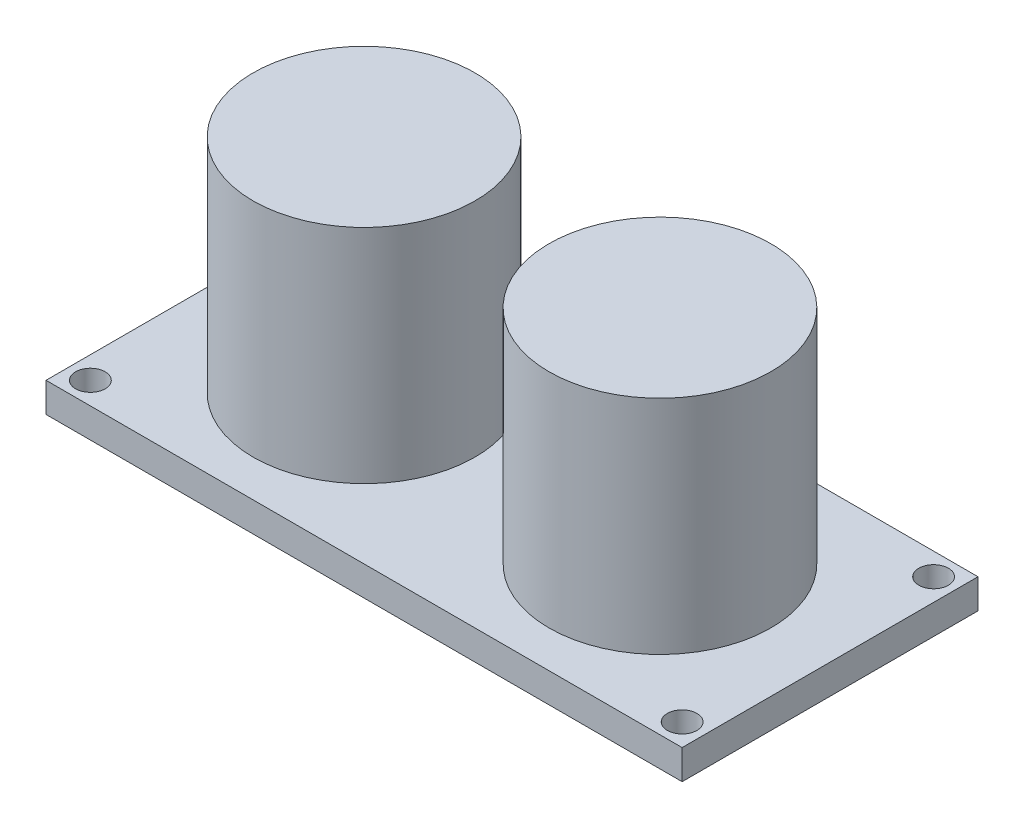
ISO-10303-21;
HEADER;
FILE_DESCRIPTION(('STEP AP214'),'2;1');
FILE_NAME('part.step','',(''),(''),'','','');
FILE_SCHEMA(('AUTOMOTIVE_DESIGN { 1 0 10303 214 1 1 1 1 }'));
ENDSEC;
DATA;
#1=APPLICATION_CONTEXT('core data for automotive mechanical design processes');
#2=APPLICATION_PROTOCOL_DEFINITION('international standard','automotive_design',2000,#1);
#3=PRODUCT_CONTEXT('',#1,'mechanical');
#4=PRODUCT('Part','Part','',(#3));
#5=PRODUCT_RELATED_PRODUCT_CATEGORY('part','',(#4));
#6=PRODUCT_DEFINITION_FORMATION('','',#4);
#7=PRODUCT_DEFINITION_CONTEXT('part definition',#1,'design');
#8=PRODUCT_DEFINITION('design','',#6,#7);
#9=PRODUCT_DEFINITION_SHAPE('','',#8);
#10=(LENGTH_UNIT() NAMED_UNIT(*) SI_UNIT(.MILLI.,.METRE.));
#11=(NAMED_UNIT(*) PLANE_ANGLE_UNIT() SI_UNIT($,.RADIAN.));
#12=(NAMED_UNIT(*) SI_UNIT($,.STERADIAN.) SOLID_ANGLE_UNIT());
#13=UNCERTAINTY_MEASURE_WITH_UNIT(LENGTH_MEASURE(1.E-05),#10,'distance_accuracy_value','');
#14=(GEOMETRIC_REPRESENTATION_CONTEXT(3) GLOBAL_UNCERTAINTY_ASSIGNED_CONTEXT((#13)) GLOBAL_UNIT_ASSIGNED_CONTEXT((#10,
#11,#12)) REPRESENTATION_CONTEXT('',''));
#15=CARTESIAN_POINT('',(0.,0.,0.));
#16=DIRECTION('',(0.,0.,1.));
#17=DIRECTION('',(1.,0.,0.));
#18=AXIS2_PLACEMENT_3D('',#15,#16,#17);
#19=CARTESIAN_POINT('',(-19.6156682014462,2.,-8.40872781352872));
#20=DIRECTION('',(1.,0.,0.));
#21=DIRECTION('',(0.,0.,-1.));
#22=AXIS2_PLACEMENT_3D('',#19,#20,#21);
#23=PLANE('',#22);
#24=DIRECTION('',(0.,0.,1.));
#25=VECTOR('',#24,1.);
#26=CARTESIAN_POINT('',(-19.6156682014462,0.,-8.40872781352872));
#27=LINE('',#26,#25);
#28=CARTESIAN_POINT('',(-19.6156682014462,0.,-8.40872781352872));
#29=VERTEX_POINT('',#28);
#30=CARTESIAN_POINT('',(-19.6156682014462,0.,11.5912721864713));
#31=VERTEX_POINT('',#30);
#32=EDGE_CURVE('E98',#29,#31,#27,.T.);
#33=ORIENTED_EDGE('',*,*,#32,.T.);
#34=DIRECTION('',(0.,-1.,0.));
#35=VECTOR('',#34,1.);
#36=CARTESIAN_POINT('',(-19.6156682014462,2.,11.5912721864713));
#37=LINE('',#36,#35);
#38=CARTESIAN_POINT('',(-19.6156682014462,2.,11.5912721864713));
#39=VERTEX_POINT('',#38);
#40=EDGE_CURVE('E11',#39,#31,#37,.T.);
#41=ORIENTED_EDGE('',*,*,#40,.F.);
#42=DIRECTION('',(0.,0.,1.));
#43=VECTOR('',#42,1.);
#44=CARTESIAN_POINT('',(-19.6156682014462,2.,-8.40872781352872));
#45=LINE('',#44,#43);
#46=CARTESIAN_POINT('',(-19.6156682014462,2.,-8.40872781352872));
#47=VERTEX_POINT('',#46);
#48=EDGE_CURVE('E86',#47,#39,#45,.T.);
#49=ORIENTED_EDGE('',*,*,#48,.F.);
#50=DIRECTION('',(0.,-1.,0.));
#51=VECTOR('',#50,1.);
#52=CARTESIAN_POINT('',(-19.6156682014462,2.,-8.40872781352872));
#53=LINE('',#52,#51);
#54=EDGE_CURVE('E94',#47,#29,#53,.T.);
#55=ORIENTED_EDGE('',*,*,#54,.T.);
#56=EDGE_LOOP('',(#33,#41,#49,#55));
#57=FACE_BOUND('',#56,.T.);
#58=ADVANCED_FACE('F35',(#57),#23,.F.);
#59=CARTESIAN_POINT('',(-19.6156682014462,2.,11.5912721864713));
#60=DIRECTION('',(0.,0.,-1.));
#61=DIRECTION('',(-1.,0.,0.));
#62=AXIS2_PLACEMENT_3D('',#59,#60,#61);
#63=PLANE('',#62);
#64=DIRECTION('',(1.,0.,0.));
#65=VECTOR('',#64,1.);
#66=CARTESIAN_POINT('',(-19.6156682014462,0.,11.5912721864713));
#67=LINE('',#66,#65);
#68=CARTESIAN_POINT('',(23.3843317985538,0.,11.5912721864713));
#69=VERTEX_POINT('',#68);
#70=EDGE_CURVE('E90',#31,#69,#67,.T.);
#71=ORIENTED_EDGE('',*,*,#70,.T.);
#72=DIRECTION('',(0.,-1.,0.));
#73=VECTOR('',#72,1.);
#74=CARTESIAN_POINT('',(23.3843317985538,2.,11.5912721864713));
#75=LINE('',#74,#73);
#76=CARTESIAN_POINT('',(23.3843317985538,2.,11.5912721864713));
#77=VERTEX_POINT('',#76);
#78=EDGE_CURVE('E43',#77,#69,#75,.T.);
#79=ORIENTED_EDGE('',*,*,#78,.F.);
#80=DIRECTION('',(1.,0.,0.));
#81=VECTOR('',#80,1.);
#82=CARTESIAN_POINT('',(-19.6156682014462,2.,11.5912721864713));
#83=LINE('',#82,#81);
#84=EDGE_CURVE('E81',#39,#77,#83,.T.);
#85=ORIENTED_EDGE('',*,*,#84,.F.);
#86=ORIENTED_EDGE('',*,*,#40,.T.);
#87=EDGE_LOOP('',(#71,#79,#85,#86));
#88=FACE_BOUND('',#87,.T.);
#89=ADVANCED_FACE('F89',(#88),#63,.F.);
#90=CARTESIAN_POINT('',(23.3843317985538,2.,-8.40872781352872));
#91=DIRECTION('',(-1.,0.,0.));
#92=DIRECTION('',(0.,0.,1.));
#93=AXIS2_PLACEMENT_3D('',#90,#91,#92);
#94=PLANE('',#93);
#95=DIRECTION('',(0.,0.,-1.));
#96=VECTOR('',#95,1.);
#97=CARTESIAN_POINT('',(23.3843317985538,0.,-8.40872781352872));
#98=LINE('',#97,#96);
#99=CARTESIAN_POINT('',(23.3843317985538,0.,-8.40872781352872));
#100=VERTEX_POINT('',#99);
#101=EDGE_CURVE('E68',#69,#100,#98,.T.);
#102=ORIENTED_EDGE('',*,*,#101,.T.);
#103=DIRECTION('',(0.,-1.,0.));
#104=VECTOR('',#103,1.);
#105=CARTESIAN_POINT('',(23.3843317985538,2.,-8.40872781352872));
#106=LINE('',#105,#104);
#107=CARTESIAN_POINT('',(23.3843317985538,2.,-8.40872781352872));
#108=VERTEX_POINT('',#107);
#109=EDGE_CURVE('E91',#108,#100,#106,.T.);
#110=ORIENTED_EDGE('',*,*,#109,.F.);
#111=DIRECTION('',(0.,0.,-1.));
#112=VECTOR('',#111,1.);
#113=CARTESIAN_POINT('',(23.3843317985538,2.,-8.40872781352872));
#114=LINE('',#113,#112);
#115=EDGE_CURVE('E84',#77,#108,#114,.T.);
#116=ORIENTED_EDGE('',*,*,#115,.F.);
#117=ORIENTED_EDGE('',*,*,#78,.T.);
#118=EDGE_LOOP('',(#102,#110,#116,#117));
#119=FACE_BOUND('',#118,.T.);
#120=ADVANCED_FACE('F92',(#119),#94,.F.);
#121=CARTESIAN_POINT('',(-19.6156682014462,2.,-8.40872781352872));
#122=DIRECTION('',(0.,0.,1.));
#123=DIRECTION('',(1.,0.,0.));
#124=AXIS2_PLACEMENT_3D('',#121,#122,#123);
#125=PLANE('',#124);
#126=DIRECTION('',(-1.,0.,0.));
#127=VECTOR('',#126,1.);
#128=CARTESIAN_POINT('',(-19.6156682014462,0.,-8.40872781352872));
#129=LINE('',#128,#127);
#130=EDGE_CURVE('E74',#100,#29,#129,.T.);
#131=ORIENTED_EDGE('',*,*,#130,.T.);
#132=ORIENTED_EDGE('',*,*,#54,.F.);
#133=DIRECTION('',(-1.,0.,0.));
#134=VECTOR('',#133,1.);
#135=CARTESIAN_POINT('',(-19.6156682014462,2.,-8.40872781352872));
#136=LINE('',#135,#134);
#137=EDGE_CURVE('E51',#108,#47,#136,.T.);
#138=ORIENTED_EDGE('',*,*,#137,.F.);
#139=ORIENTED_EDGE('',*,*,#109,.T.);
#140=EDGE_LOOP('',(#131,#132,#138,#139));
#141=FACE_BOUND('',#140,.T.);
#142=ADVANCED_FACE('F106',(#141),#125,.F.);
#143=CARTESIAN_POINT('',(0.,2.,0.));
#144=DIRECTION('',(0.,1.,0.));
#145=DIRECTION('',(0.,0.,1.));
#146=AXIS2_PLACEMENT_3D('',#143,#144,#145);
#147=PLANE('',#146);
#148=CARTESIAN_POINT('',(-8.11566820144619,2.,1.59127218647128));
#149=DIRECTION('',(0.,1.,0.));
#150=DIRECTION('',(0.,0.,1.));
#151=AXIS2_PLACEMENT_3D('',#148,#149,#150);
#152=CIRCLE('',#151,7.5);
#153=CARTESIAN_POINT('',(-8.11566820144619,2.,9.09127218647128));
#154=VERTEX_POINT('',#153);
#155=EDGE_CURVE('E142',#154,#154,#152,.T.);
#156=ORIENTED_EDGE('',*,*,#155,.F.);
#157=EDGE_LOOP('',(#156));
#158=FACE_BOUND('',#157,.T.);
#159=CARTESIAN_POINT('',(11.8843317985538,2.,1.59127218647128));
#160=DIRECTION('',(0.,1.,0.));
#161=DIRECTION('',(0.,0.,1.));
#162=AXIS2_PLACEMENT_3D('',#159,#160,#161);
#163=CIRCLE('',#162,7.5);
#164=CARTESIAN_POINT('',(11.8843317985538,2.,9.09127218647128));
#165=VERTEX_POINT('',#164);
#166=EDGE_CURVE('E136',#165,#165,#163,.T.);
#167=ORIENTED_EDGE('',*,*,#166,.F.);
#168=EDGE_LOOP('',(#167));
#169=FACE_BOUND('',#168,.T.);
#170=CARTESIAN_POINT('',(21.8843317985538,2.,-6.90872781352872));
#171=DIRECTION('',(0.,1.,0.));
#172=DIRECTION('',(0.,0.,1.));
#173=AXIS2_PLACEMENT_3D('',#170,#171,#172);
#174=CIRCLE('',#173,1.);
#175=CARTESIAN_POINT('',(21.8843317985538,2.,-5.90872781352872));
#176=VERTEX_POINT('',#175);
#177=EDGE_CURVE('E130',#176,#176,#174,.T.);
#178=ORIENTED_EDGE('',*,*,#177,.F.);
#179=EDGE_LOOP('',(#178));
#180=FACE_BOUND('',#179,.T.);
#181=CARTESIAN_POINT('',(-18.1156682014462,2.,-6.90872781352872));
#182=DIRECTION('',(0.,1.,0.));
#183=DIRECTION('',(0.,0.,1.));
#184=AXIS2_PLACEMENT_3D('',#181,#182,#183);
#185=CIRCLE('',#184,1.);
#186=CARTESIAN_POINT('',(-18.1156682014462,2.,-5.90872781352872));
#187=VERTEX_POINT('',#186);
#188=EDGE_CURVE('E124',#187,#187,#185,.T.);
#189=ORIENTED_EDGE('',*,*,#188,.F.);
#190=EDGE_LOOP('',(#189));
#191=FACE_BOUND('',#190,.T.);
#192=CARTESIAN_POINT('',(21.8843317985538,2.,10.0912721864713));
#193=DIRECTION('',(0.,1.,0.));
#194=DIRECTION('',(0.,0.,1.));
#195=AXIS2_PLACEMENT_3D('',#192,#193,#194);
#196=CIRCLE('',#195,1.);
#197=CARTESIAN_POINT('',(21.8843317985538,2.,11.0912721864713));
#198=VERTEX_POINT('',#197);
#199=EDGE_CURVE('E118',#198,#198,#196,.T.);
#200=ORIENTED_EDGE('',*,*,#199,.F.);
#201=EDGE_LOOP('',(#200));
#202=FACE_BOUND('',#201,.T.);
#203=CARTESIAN_POINT('',(-18.1156682014462,2.,10.0912721864713));
#204=DIRECTION('',(0.,1.,0.));
#205=DIRECTION('',(0.,0.,1.));
#206=AXIS2_PLACEMENT_3D('',#203,#204,#205);
#207=CIRCLE('',#206,1.);
#208=CARTESIAN_POINT('',(-18.1156682014462,2.,11.0912721864713));
#209=VERTEX_POINT('',#208);
#210=EDGE_CURVE('E112',#209,#209,#207,.T.);
#211=ORIENTED_EDGE('',*,*,#210,.F.);
#212=EDGE_LOOP('',(#211));
#213=FACE_BOUND('',#212,.T.);
#214=ORIENTED_EDGE('',*,*,#48,.T.);
#215=ORIENTED_EDGE('',*,*,#84,.T.);
#216=ORIENTED_EDGE('',*,*,#115,.T.);
#217=ORIENTED_EDGE('',*,*,#137,.T.);
#218=EDGE_LOOP('',(#214,#215,#216,#217));
#219=FACE_BOUND('',#218,.T.);
#220=ADVANCED_FACE('F82',(#158,#169,#180,#191,#202,#213,#219),#147,.T.);
#221=CARTESIAN_POINT('',(0.,0.,0.));
#222=DIRECTION('',(0.,1.,0.));
#223=DIRECTION('',(0.,0.,1.));
#224=AXIS2_PLACEMENT_3D('',#221,#222,#223);
#225=PLANE('',#224);
#226=CARTESIAN_POINT('',(21.8843317985538,0.,-6.90872781352872));
#227=DIRECTION('',(0.,1.,0.));
#228=DIRECTION('',(0.,0.,1.));
#229=AXIS2_PLACEMENT_3D('',#226,#227,#228);
#230=CIRCLE('',#229,1.);
#231=CARTESIAN_POINT('',(21.8843317985538,0.,-5.90872781352872));
#232=VERTEX_POINT('',#231);
#233=EDGE_CURVE('E127',#232,#232,#230,.T.);
#234=ORIENTED_EDGE('',*,*,#233,.T.);
#235=EDGE_LOOP('',(#234));
#236=FACE_BOUND('',#235,.T.);
#237=CARTESIAN_POINT('',(-18.1156682014462,0.,-6.90872781352872));
#238=DIRECTION('',(0.,1.,0.));
#239=DIRECTION('',(0.,0.,1.));
#240=AXIS2_PLACEMENT_3D('',#237,#238,#239);
#241=CIRCLE('',#240,1.);
#242=CARTESIAN_POINT('',(-18.1156682014462,0.,-5.90872781352872));
#243=VERTEX_POINT('',#242);
#244=EDGE_CURVE('E121',#243,#243,#241,.T.);
#245=ORIENTED_EDGE('',*,*,#244,.T.);
#246=EDGE_LOOP('',(#245));
#247=FACE_BOUND('',#246,.T.);
#248=CARTESIAN_POINT('',(21.8843317985538,0.,10.0912721864713));
#249=DIRECTION('',(0.,1.,0.));
#250=DIRECTION('',(0.,0.,1.));
#251=AXIS2_PLACEMENT_3D('',#248,#249,#250);
#252=CIRCLE('',#251,1.);
#253=CARTESIAN_POINT('',(21.8843317985538,0.,11.0912721864713));
#254=VERTEX_POINT('',#253);
#255=EDGE_CURVE('E115',#254,#254,#252,.T.);
#256=ORIENTED_EDGE('',*,*,#255,.T.);
#257=EDGE_LOOP('',(#256));
#258=FACE_BOUND('',#257,.T.);
#259=CARTESIAN_POINT('',(-18.1156682014462,0.,10.0912721864713));
#260=DIRECTION('',(0.,1.,0.));
#261=DIRECTION('',(0.,0.,1.));
#262=AXIS2_PLACEMENT_3D('',#259,#260,#261);
#263=CIRCLE('',#262,1.);
#264=CARTESIAN_POINT('',(-18.1156682014462,0.,11.0912721864713));
#265=VERTEX_POINT('',#264);
#266=EDGE_CURVE('E101',#265,#265,#263,.T.);
#267=ORIENTED_EDGE('',*,*,#266,.T.);
#268=EDGE_LOOP('',(#267));
#269=FACE_BOUND('',#268,.T.);
#270=ORIENTED_EDGE('',*,*,#32,.F.);
#271=ORIENTED_EDGE('',*,*,#130,.F.);
#272=ORIENTED_EDGE('',*,*,#101,.F.);
#273=ORIENTED_EDGE('',*,*,#70,.F.);
#274=EDGE_LOOP('',(#270,#271,#272,#273));
#275=FACE_BOUND('',#274,.T.);
#276=ADVANCED_FACE('F109',(#236,#247,#258,#269,#275),#225,.F.);
#277=CARTESIAN_POINT('',(-18.1156682014462,0.,10.0912721864713));
#278=DIRECTION('',(0.,1.,0.));
#279=DIRECTION('',(0.,0.,1.));
#280=AXIS2_PLACEMENT_3D('',#277,#278,#279);
#281=CYLINDRICAL_SURFACE('',#280,1.);
#282=ORIENTED_EDGE('',*,*,#266,.F.);
#283=EDGE_LOOP('',(#282));
#284=FACE_BOUND('',#283,.T.);
#285=ORIENTED_EDGE('',*,*,#210,.T.);
#286=EDGE_LOOP('',(#285));
#287=FACE_BOUND('',#286,.T.);
#288=ADVANCED_FACE('F170',(#284,#287),#281,.F.);
#289=CARTESIAN_POINT('',(21.8843317985538,0.,10.0912721864713));
#290=DIRECTION('',(0.,1.,0.));
#291=DIRECTION('',(0.,0.,1.));
#292=AXIS2_PLACEMENT_3D('',#289,#290,#291);
#293=CYLINDRICAL_SURFACE('',#292,1.);
#294=ORIENTED_EDGE('',*,*,#255,.F.);
#295=EDGE_LOOP('',(#294));
#296=FACE_BOUND('',#295,.T.);
#297=ORIENTED_EDGE('',*,*,#199,.T.);
#298=EDGE_LOOP('',(#297));
#299=FACE_BOUND('',#298,.T.);
#300=ADVANCED_FACE('F172',(#296,#299),#293,.F.);
#301=CARTESIAN_POINT('',(-18.1156682014462,0.,-6.90872781352872));
#302=DIRECTION('',(0.,1.,0.));
#303=DIRECTION('',(0.,0.,1.));
#304=AXIS2_PLACEMENT_3D('',#301,#302,#303);
#305=CYLINDRICAL_SURFACE('',#304,1.);
#306=ORIENTED_EDGE('',*,*,#244,.F.);
#307=EDGE_LOOP('',(#306));
#308=FACE_BOUND('',#307,.T.);
#309=ORIENTED_EDGE('',*,*,#188,.T.);
#310=EDGE_LOOP('',(#309));
#311=FACE_BOUND('',#310,.T.);
#312=ADVANCED_FACE('F179',(#308,#311),#305,.F.);
#313=CARTESIAN_POINT('',(21.8843317985538,0.,-6.90872781352872));
#314=DIRECTION('',(0.,1.,0.));
#315=DIRECTION('',(0.,0.,1.));
#316=AXIS2_PLACEMENT_3D('',#313,#314,#315);
#317=CYLINDRICAL_SURFACE('',#316,1.);
#318=ORIENTED_EDGE('',*,*,#233,.F.);
#319=EDGE_LOOP('',(#318));
#320=FACE_BOUND('',#319,.T.);
#321=ORIENTED_EDGE('',*,*,#177,.T.);
#322=EDGE_LOOP('',(#321));
#323=FACE_BOUND('',#322,.T.);
#324=ADVANCED_FACE('F227',(#320,#323),#317,.F.);
#325=CARTESIAN_POINT('',(11.8843317985538,17.,1.59127218647128));
#326=DIRECTION('',(0.,-1.,0.));
#327=DIRECTION('',(0.,0.,-1.));
#328=AXIS2_PLACEMENT_3D('',#325,#326,#327);
#329=CYLINDRICAL_SURFACE('',#328,7.5);
#330=CARTESIAN_POINT('',(11.8843317985538,17.,1.59127218647128));
#331=DIRECTION('',(0.,1.,0.));
#332=DIRECTION('',(0.,0.,1.));
#333=AXIS2_PLACEMENT_3D('',#330,#331,#332);
#334=CIRCLE('',#333,7.5);
#335=CARTESIAN_POINT('',(11.8843317985538,17.,9.09127218647128));
#336=VERTEX_POINT('',#335);
#337=EDGE_CURVE('E133',#336,#336,#334,.T.);
#338=ORIENTED_EDGE('',*,*,#337,.F.);
#339=EDGE_LOOP('',(#338));
#340=FACE_BOUND('',#339,.T.);
#341=ORIENTED_EDGE('',*,*,#166,.T.);
#342=EDGE_LOOP('',(#341));
#343=FACE_BOUND('',#342,.T.);
#344=ADVANCED_FACE('F236',(#340,#343),#329,.T.);
#345=CARTESIAN_POINT('',(11.8843317985538,17.,1.59127218647128));
#346=DIRECTION('',(0.,1.,0.));
#347=DIRECTION('',(0.,0.,1.));
#348=AXIS2_PLACEMENT_3D('',#345,#346,#347);
#349=PLANE('',#348);
#350=ORIENTED_EDGE('',*,*,#337,.T.);
#351=EDGE_LOOP('',(#350));
#352=FACE_BOUND('',#351,.T.);
#353=ADVANCED_FACE('F153',(#352),#349,.T.);
#354=CARTESIAN_POINT('',(-8.11566820144619,17.,1.59127218647128));
#355=DIRECTION('',(0.,-1.,0.));
#356=DIRECTION('',(0.,0.,-1.));
#357=AXIS2_PLACEMENT_3D('',#354,#355,#356);
#358=CYLINDRICAL_SURFACE('',#357,7.5);
#359=CARTESIAN_POINT('',(-8.11566820144619,17.,1.59127218647128));
#360=DIRECTION('',(0.,1.,0.));
#361=DIRECTION('',(0.,0.,1.));
#362=AXIS2_PLACEMENT_3D('',#359,#360,#361);
#363=CIRCLE('',#362,7.5);
#364=CARTESIAN_POINT('',(-8.11566820144619,17.,9.09127218647128));
#365=VERTEX_POINT('',#364);
#366=EDGE_CURVE('E139',#365,#365,#363,.T.);
#367=ORIENTED_EDGE('',*,*,#366,.F.);
#368=EDGE_LOOP('',(#367));
#369=FACE_BOUND('',#368,.T.);
#370=ORIENTED_EDGE('',*,*,#155,.T.);
#371=EDGE_LOOP('',(#370));
#372=FACE_BOUND('',#371,.T.);
#373=ADVANCED_FACE('F150',(#369,#372),#358,.T.);
#374=CARTESIAN_POINT('',(-8.11566820144619,17.,1.59127218647128));
#375=DIRECTION('',(0.,1.,0.));
#376=DIRECTION('',(0.,0.,1.));
#377=AXIS2_PLACEMENT_3D('',#374,#375,#376);
#378=PLANE('',#377);
#379=ORIENTED_EDGE('',*,*,#366,.T.);
#380=EDGE_LOOP('',(#379));
#381=FACE_BOUND('',#380,.T.);
#382=ADVANCED_FACE('F148',(#381),#378,.T.);
#383=CLOSED_SHELL('',(#58,#89,#120,#142,#220,#276,#288,#300,#312,#324,#344,#353,#373,#382));
#384=MANIFOLD_SOLID_BREP('B2',#383);
#385=ADVANCED_BREP_SHAPE_REPRESENTATION('',(#18,#384),#14);
#386=SHAPE_DEFINITION_REPRESENTATION(#9,#385);
ENDSEC;
END-ISO-10303-21;
